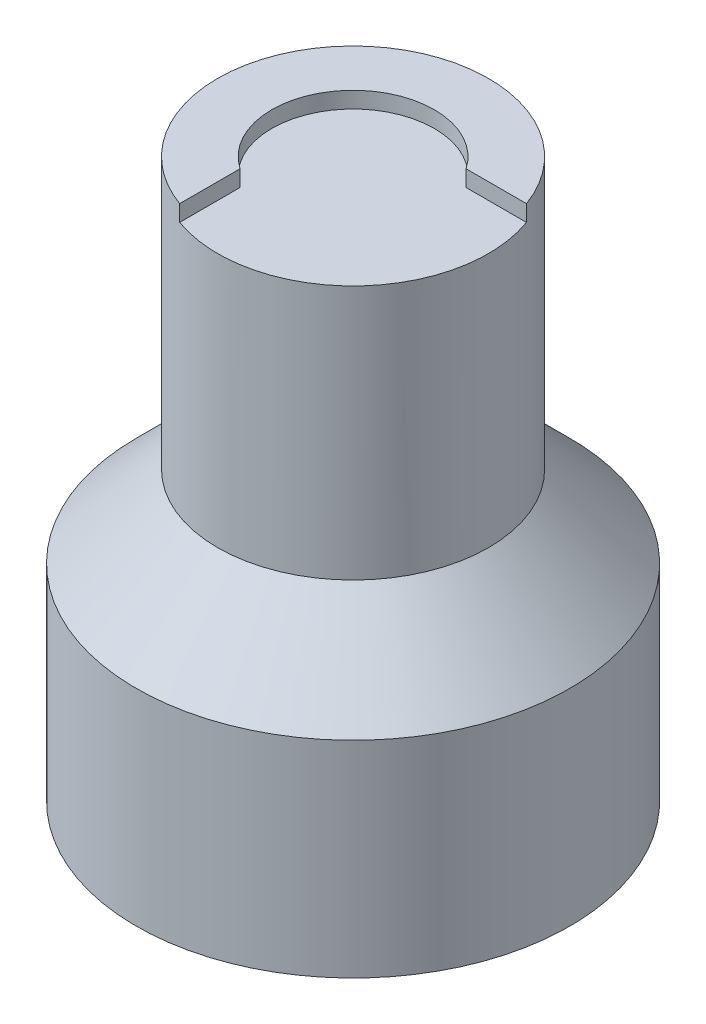
ISO-10303-21;
HEADER;
FILE_DESCRIPTION(('STEP AP214'),'2;1');
FILE_NAME('part.step','',(''),(''),'','','');
FILE_SCHEMA(('AUTOMOTIVE_DESIGN { 1 0 10303 214 1 1 1 1 }'));
ENDSEC;
DATA;
#1=APPLICATION_CONTEXT('core data for automotive mechanical design processes');
#2=APPLICATION_PROTOCOL_DEFINITION('international standard','automotive_design',2000,#1);
#3=PRODUCT_CONTEXT('',#1,'mechanical');
#4=PRODUCT('Part','Part','',(#3));
#5=PRODUCT_RELATED_PRODUCT_CATEGORY('part','',(#4));
#6=PRODUCT_DEFINITION_FORMATION('','',#4);
#7=PRODUCT_DEFINITION_CONTEXT('part definition',#1,'design');
#8=PRODUCT_DEFINITION('design','',#6,#7);
#9=PRODUCT_DEFINITION_SHAPE('','',#8);
#10=(LENGTH_UNIT() NAMED_UNIT(*) SI_UNIT(.MILLI.,.METRE.));
#11=(NAMED_UNIT(*) PLANE_ANGLE_UNIT() SI_UNIT($,.RADIAN.));
#12=(NAMED_UNIT(*) SI_UNIT($,.STERADIAN.) SOLID_ANGLE_UNIT());
#13=UNCERTAINTY_MEASURE_WITH_UNIT(LENGTH_MEASURE(1.E-05),#10,'distance_accuracy_value','');
#14=(GEOMETRIC_REPRESENTATION_CONTEXT(3) GLOBAL_UNCERTAINTY_ASSIGNED_CONTEXT((#13)) GLOBAL_UNIT_ASSIGNED_CONTEXT((#10,
#11,#12)) REPRESENTATION_CONTEXT('',''));
#15=CARTESIAN_POINT('',(0.,0.,0.));
#16=DIRECTION('',(0.,0.,1.));
#17=DIRECTION('',(1.,0.,0.));
#18=AXIS2_PLACEMENT_3D('',#15,#16,#17);
#19=CARTESIAN_POINT('',(0.,-10.3,0.));
#20=DIRECTION('',(0.,-1.,0.));
#21=DIRECTION('',(1.,0.,0.));
#22=AXIS2_PLACEMENT_3D('',#19,#20,#21);
#23=PLANE('',#22);
#24=CARTESIAN_POINT('',(0.,-10.3,0.));
#25=DIRECTION('',(0.,-1.,0.));
#26=DIRECTION('',(1.,0.,0.));
#27=AXIS2_PLACEMENT_3D('',#24,#25,#26);
#28=CIRCLE('',#27,5.1);
#29=CARTESIAN_POINT('',(5.1,-10.3,0.));
#30=VERTEX_POINT('',#29);
#31=EDGE_CURVE('E99',#30,#30,#28,.T.);
#32=ORIENTED_EDGE('',*,*,#31,.F.);
#33=EDGE_LOOP('',(#32));
#34=FACE_BOUND('',#33,.T.);
#35=CARTESIAN_POINT('',(0.,-10.3,0.));
#36=DIRECTION('',(0.,1.,0.));
#37=DIRECTION('',(-1.,0.,0.));
#38=AXIS2_PLACEMENT_3D('',#35,#36,#37);
#39=CIRCLE('',#38,8.);
#40=CARTESIAN_POINT('',(-8.,-10.3,0.));
#41=VERTEX_POINT('',#40);
#42=EDGE_CURVE('E149',#41,#41,#39,.T.);
#43=ORIENTED_EDGE('',*,*,#42,.F.);
#44=EDGE_LOOP('',(#43));
#45=FACE_BOUND('',#44,.T.);
#46=ADVANCED_FACE('F43',(#34,#45),#23,.T.);
#47=CARTESIAN_POINT('',(0.,10.3,0.));
#48=DIRECTION('',(0.,1.,0.));
#49=DIRECTION('',(-1.,0.,0.));
#50=AXIS2_PLACEMENT_3D('',#47,#48,#49);
#51=CYLINDRICAL_SURFACE('',#50,8.);
#52=CARTESIAN_POINT('',(0.,-2.70000000000001,0.));
#53=DIRECTION('',(0.,1.,0.));
#54=DIRECTION('',(-1.,0.,0.));
#55=AXIS2_PLACEMENT_3D('',#52,#53,#54);
#56=CIRCLE('',#55,8.);
#57=CARTESIAN_POINT('',(-8.,-2.70000000000001,0.));
#58=VERTEX_POINT('',#57);
#59=EDGE_CURVE('E11',#58,#58,#56,.F.);
#60=ORIENTED_EDGE('',*,*,#59,.T.);
#61=EDGE_LOOP('',(#60));
#62=FACE_BOUND('',#61,.T.);
#63=ORIENTED_EDGE('',*,*,#42,.T.);
#64=EDGE_LOOP('',(#63));
#65=FACE_BOUND('',#64,.T.);
#66=ADVANCED_FACE('F183',(#62,#65),#51,.T.);
#67=CARTESIAN_POINT('',(0.,10.3,0.));
#68=DIRECTION('',(0.,1.,0.));
#69=DIRECTION('',(-1.,0.,0.));
#70=AXIS2_PLACEMENT_3D('',#67,#68,#69);
#71=CYLINDRICAL_SURFACE('',#70,5.);
#72=DIRECTION('',(0.,1.,0.));
#73=VECTOR('',#72,1.);
#74=CARTESIAN_POINT('',(-1.69669914110089,10.3,4.7033192560773));
#75=LINE('',#74,#73);
#76=CARTESIAN_POINT('',(-1.69669914110089,10.3,4.7033192560773));
#77=VERTEX_POINT('',#76);
#78=CARTESIAN_POINT('',(-1.69669914110089,9.7,4.7033192560773));
#79=VERTEX_POINT('',#78);
#80=EDGE_CURVE('E67',#77,#79,#75,.F.);
#81=ORIENTED_EDGE('',*,*,#80,.F.);
#82=CARTESIAN_POINT('',(0.,10.3,0.));
#83=DIRECTION('',(0.,1.,0.));
#84=DIRECTION('',(-1.,0.,0.));
#85=AXIS2_PLACEMENT_3D('',#82,#83,#84);
#86=CIRCLE('',#85,5.);
#87=CARTESIAN_POINT('',(4.70331925607729,10.3,-1.6966991411009));
#88=VERTEX_POINT('',#87);
#89=EDGE_CURVE('E141',#88,#77,#86,.T.);
#90=ORIENTED_EDGE('',*,*,#89,.F.);
#91=DIRECTION('',(0.,1.,0.));
#92=VECTOR('',#91,1.);
#93=CARTESIAN_POINT('',(4.70331925607729,10.3,-1.6966991411009));
#94=LINE('',#93,#92);
#95=CARTESIAN_POINT('',(4.70331925607729,9.7,-1.6966991411009));
#96=VERTEX_POINT('',#95);
#97=EDGE_CURVE('E59',#96,#88,#94,.T.);
#98=ORIENTED_EDGE('',*,*,#97,.F.);
#99=CARTESIAN_POINT('',(0.,9.7,0.));
#100=DIRECTION('',(0.,1.,0.));
#101=DIRECTION('',(-1.,0.,0.));
#102=AXIS2_PLACEMENT_3D('',#99,#100,#101);
#103=CIRCLE('',#102,5.);
#104=EDGE_CURVE('E52',#96,#79,#103,.F.);
#105=ORIENTED_EDGE('',*,*,#104,.T.);
#106=EDGE_LOOP('',(#81,#90,#98,#105));
#107=FACE_BOUND('',#106,.T.);
#108=CARTESIAN_POINT('',(0.,0.300000000000002,0.));
#109=DIRECTION('',(0.,1.,0.));
#110=DIRECTION('',(-1.,0.,0.));
#111=AXIS2_PLACEMENT_3D('',#108,#109,#110);
#112=CIRCLE('',#111,5.);
#113=CARTESIAN_POINT('',(-5.,0.3,0.));
#114=VERTEX_POINT('',#113);
#115=EDGE_CURVE('E145',#114,#114,#112,.T.);
#116=ORIENTED_EDGE('',*,*,#115,.T.);
#117=EDGE_LOOP('',(#116));
#118=FACE_BOUND('',#117,.T.);
#119=ADVANCED_FACE('F158',(#107,#118),#71,.T.);
#120=CARTESIAN_POINT('',(0.,10.3,0.));
#121=DIRECTION('',(0.,1.,0.));
#122=DIRECTION('',(-1.,0.,0.));
#123=AXIS2_PLACEMENT_3D('',#120,#121,#122);
#124=PLANE('',#123);
#125=DIRECTION('',(0.,0.,1.));
#126=VECTOR('',#125,1.);
#127=CARTESIAN_POINT('',(-1.69669914110089,10.3,2.47410832919408));
#128=LINE('',#127,#126);
#129=CARTESIAN_POINT('',(-1.69669914110089,10.3,2.47410832919408));
#130=VERTEX_POINT('',#129);
#131=EDGE_CURVE('E118',#130,#77,#128,.T.);
#132=ORIENTED_EDGE('',*,*,#131,.F.);
#133=CARTESIAN_POINT('',(0.,10.3,0.));
#134=DIRECTION('',(0.,1.,0.));
#135=DIRECTION('',(-1.,0.,0.));
#136=AXIS2_PLACEMENT_3D('',#133,#134,#135);
#137=CIRCLE('',#136,3.);
#138=CARTESIAN_POINT('',(2.47410832919406,10.3,-1.6966991411009));
#139=VERTEX_POINT('',#138);
#140=EDGE_CURVE('E112',#139,#130,#137,.T.);
#141=ORIENTED_EDGE('',*,*,#140,.F.);
#142=DIRECTION('',(-1.,0.,0.));
#143=VECTOR('',#142,1.);
#144=CARTESIAN_POINT('',(0.,10.3,-1.6966991411009));
#145=LINE('',#144,#143);
#146=EDGE_CURVE('E153',#88,#139,#145,.T.);
#147=ORIENTED_EDGE('',*,*,#146,.F.);
#148=ORIENTED_EDGE('',*,*,#89,.T.);
#149=EDGE_LOOP('',(#132,#141,#147,#148));
#150=FACE_BOUND('',#149,.T.);
#151=ADVANCED_FACE('F172',(#150),#124,.T.);
#152=CARTESIAN_POINT('',(-1.69669914110089,9.7,2.47410832919408));
#153=DIRECTION('',(-1.,0.,0.));
#154=DIRECTION('',(0.,0.,1.));
#155=AXIS2_PLACEMENT_3D('',#152,#153,#154);
#156=PLANE('',#155);
#157=ORIENTED_EDGE('',*,*,#80,.T.);
#158=DIRECTION('',(0.,0.,1.));
#159=VECTOR('',#158,1.);
#160=CARTESIAN_POINT('',(-1.69669914110089,9.7,2.47410832919408));
#161=LINE('',#160,#159);
#162=CARTESIAN_POINT('',(-1.69669914110089,9.7,2.47410832919408));
#163=VERTEX_POINT('',#162);
#164=EDGE_CURVE('E122',#163,#79,#161,.T.);
#165=ORIENTED_EDGE('',*,*,#164,.F.);
#166=DIRECTION('',(0.,1.,0.));
#167=VECTOR('',#166,1.);
#168=CARTESIAN_POINT('',(-1.69669914110089,9.7,2.47410832919408));
#169=LINE('',#168,#167);
#170=EDGE_CURVE('E131',#163,#130,#169,.T.);
#171=ORIENTED_EDGE('',*,*,#170,.T.);
#172=ORIENTED_EDGE('',*,*,#131,.T.);
#173=EDGE_LOOP('',(#157,#165,#171,#172));
#174=FACE_BOUND('',#173,.T.);
#175=ADVANCED_FACE('F170',(#174),#156,.F.);
#176=CARTESIAN_POINT('',(0.,9.7,0.));
#177=DIRECTION('',(0.,1.,0.));
#178=DIRECTION('',(-1.,0.,0.));
#179=AXIS2_PLACEMENT_3D('',#176,#177,#178);
#180=CYLINDRICAL_SURFACE('',#179,3.);
#181=ORIENTED_EDGE('',*,*,#140,.T.);
#182=ORIENTED_EDGE('',*,*,#170,.F.);
#183=CARTESIAN_POINT('',(0.,9.7,0.));
#184=DIRECTION('',(0.,1.,0.));
#185=DIRECTION('',(-1.,0.,0.));
#186=AXIS2_PLACEMENT_3D('',#183,#184,#185);
#187=CIRCLE('',#186,3.);
#188=CARTESIAN_POINT('',(2.47410832919406,9.7,-1.6966991411009));
#189=VERTEX_POINT('',#188);
#190=EDGE_CURVE('E117',#189,#163,#187,.T.);
#191=ORIENTED_EDGE('',*,*,#190,.F.);
#192=DIRECTION('',(0.,1.,0.));
#193=VECTOR('',#192,1.);
#194=CARTESIAN_POINT('',(2.47410832919406,9.7,-1.6966991411009));
#195=LINE('',#194,#193);
#196=EDGE_CURVE('E125',#189,#139,#195,.T.);
#197=ORIENTED_EDGE('',*,*,#196,.T.);
#198=EDGE_LOOP('',(#181,#182,#191,#197));
#199=FACE_BOUND('',#198,.T.);
#200=ADVANCED_FACE('F168',(#199),#180,.F.);
#201=CARTESIAN_POINT('',(2.47410832919406,9.7,-1.6966991411009));
#202=DIRECTION('',(0.,0.,-1.));
#203=DIRECTION('',(-1.,0.,0.));
#204=AXIS2_PLACEMENT_3D('',#201,#202,#203);
#205=PLANE('',#204);
#206=ORIENTED_EDGE('',*,*,#97,.T.);
#207=ORIENTED_EDGE('',*,*,#146,.T.);
#208=ORIENTED_EDGE('',*,*,#196,.F.);
#209=DIRECTION('',(-1.,0.,0.));
#210=VECTOR('',#209,1.);
#211=CARTESIAN_POINT('',(2.47410832919406,9.7,-1.6966991411009));
#212=LINE('',#211,#210);
#213=EDGE_CURVE('E114',#96,#189,#212,.T.);
#214=ORIENTED_EDGE('',*,*,#213,.F.);
#215=EDGE_LOOP('',(#206,#207,#208,#214));
#216=FACE_BOUND('',#215,.T.);
#217=ADVANCED_FACE('F164',(#216),#205,.F.);
#218=CARTESIAN_POINT('',(0.,9.7,0.));
#219=DIRECTION('',(0.,1.,0.));
#220=DIRECTION('',(-1.,0.,0.));
#221=AXIS2_PLACEMENT_3D('',#218,#219,#220);
#222=PLANE('',#221);
#223=ORIENTED_EDGE('',*,*,#213,.T.);
#224=ORIENTED_EDGE('',*,*,#190,.T.);
#225=ORIENTED_EDGE('',*,*,#164,.T.);
#226=ORIENTED_EDGE('',*,*,#104,.F.);
#227=EDGE_LOOP('',(#223,#224,#225,#226));
#228=FACE_BOUND('',#227,.T.);
#229=ADVANCED_FACE('F162',(#228),#222,.T.);
#230=CARTESIAN_POINT('',(0.,0.300000000000002,0.));
#231=DIRECTION('',(0.,-1.,0.));
#232=DIRECTION('',(1.,0.,0.));
#233=AXIS2_PLACEMENT_3D('',#230,#231,#232);
#234=CONICAL_SURFACE('',#233,5.00000000000001,0.785398163397446);
#235=ORIENTED_EDGE('',*,*,#59,.F.);
#236=EDGE_LOOP('',(#235));
#237=FACE_BOUND('',#236,.T.);
#238=ORIENTED_EDGE('',*,*,#115,.F.);
#239=EDGE_LOOP('',(#238));
#240=FACE_BOUND('',#239,.T.);
#241=ADVANCED_FACE('F45',(#237,#240),#234,.T.);
#242=CARTESIAN_POINT('',(0.,-5.2,0.));
#243=DIRECTION('',(0.,-1.,0.));
#244=DIRECTION('',(1.,0.,0.));
#245=AXIS2_PLACEMENT_3D('',#242,#243,#244);
#246=CYLINDRICAL_SURFACE('',#245,5.1);
#247=CARTESIAN_POINT('',(0.,-5.2,0.));
#248=DIRECTION('',(0.,-1.,0.));
#249=DIRECTION('',(1.,0.,0.));
#250=AXIS2_PLACEMENT_3D('',#247,#248,#249);
#251=CIRCLE('',#250,5.1);
#252=CARTESIAN_POINT('',(5.1,-5.2,0.));
#253=VERTEX_POINT('',#252);
#254=EDGE_CURVE('E105',#253,#253,#251,.T.);
#255=ORIENTED_EDGE('',*,*,#254,.F.);
#256=EDGE_LOOP('',(#255));
#257=FACE_BOUND('',#256,.T.);
#258=ORIENTED_EDGE('',*,*,#31,.T.);
#259=EDGE_LOOP('',(#258));
#260=FACE_BOUND('',#259,.T.);
#261=ADVANCED_FACE('F202',(#257,#260),#246,.F.);
#262=CARTESIAN_POINT('',(0.,-5.2,0.));
#263=DIRECTION('',(0.,-1.,0.));
#264=DIRECTION('',(1.,0.,0.));
#265=AXIS2_PLACEMENT_3D('',#262,#263,#264);
#266=PLANE('',#265);
#267=CARTESIAN_POINT('',(0.,-5.2,0.));
#268=DIRECTION('',(0.,-1.,0.));
#269=DIRECTION('',(0.,0.,-1.));
#270=AXIS2_PLACEMENT_3D('',#267,#268,#269);
#271=CIRCLE('',#270,1.25);
#272=CARTESIAN_POINT('',(0.,-5.2,-1.25));
#273=VERTEX_POINT('',#272);
#274=EDGE_CURVE('E100',#273,#273,#271,.T.);
#275=ORIENTED_EDGE('',*,*,#274,.F.);
#276=EDGE_LOOP('',(#275));
#277=FACE_BOUND('',#276,.T.);
#278=ORIENTED_EDGE('',*,*,#254,.T.);
#279=EDGE_LOOP('',(#278));
#280=FACE_BOUND('',#279,.T.);
#281=ADVANCED_FACE('F92',(#277,#280),#266,.T.);
#282=CARTESIAN_POINT('',(0.,4.8,0.));
#283=DIRECTION('',(0.,-1.,0.));
#284=DIRECTION('',(0.,0.,-1.));
#285=AXIS2_PLACEMENT_3D('',#282,#283,#284);
#286=CONICAL_SURFACE('',#285,1.25,1.02974425867665);
#287=CARTESIAN_POINT('',(0.,5.55107577378445,0.));
#288=VERTEX_POINT('',#287);
#289=VERTEX_LOOP('',#288);
#290=FACE_BOUND('',#289,.T.);
#291=CARTESIAN_POINT('',(0.,4.8,0.));
#292=DIRECTION('',(0.,-1.,0.));
#293=DIRECTION('',(0.,0.,-1.));
#294=AXIS2_PLACEMENT_3D('',#291,#292,#293);
#295=CIRCLE('',#294,1.25);
#296=CARTESIAN_POINT('',(0.,4.8,-1.25));
#297=VERTEX_POINT('',#296);
#298=EDGE_CURVE('E96',#297,#297,#295,.T.);
#299=ORIENTED_EDGE('',*,*,#298,.T.);
#300=EDGE_LOOP('',(#299));
#301=FACE_BOUND('',#300,.T.);
#302=ADVANCED_FACE('F88',(#290,#301),#286,.F.);
#303=CARTESIAN_POINT('',(0.,-5.2,0.));
#304=DIRECTION('',(0.,-1.,0.));
#305=DIRECTION('',(0.,0.,-1.));
#306=AXIS2_PLACEMENT_3D('',#303,#304,#305);
#307=CYLINDRICAL_SURFACE('',#306,1.25);
#308=ORIENTED_EDGE('',*,*,#298,.F.);
#309=EDGE_LOOP('',(#308));
#310=FACE_BOUND('',#309,.T.);
#311=ORIENTED_EDGE('',*,*,#274,.T.);
#312=EDGE_LOOP('',(#311));
#313=FACE_BOUND('',#312,.T.);
#314=ADVANCED_FACE('F91',(#310,#313),#307,.F.);
#315=CLOSED_SHELL('',(#46,#66,#119,#151,#175,#200,#217,#229,#241,#261,#281,#302,#314));
#316=MANIFOLD_SOLID_BREP('B2',#315);
#317=ADVANCED_BREP_SHAPE_REPRESENTATION('',(#18,#316),#14);
#318=SHAPE_DEFINITION_REPRESENTATION(#9,#317);
ENDSEC;
END-ISO-10303-21;
